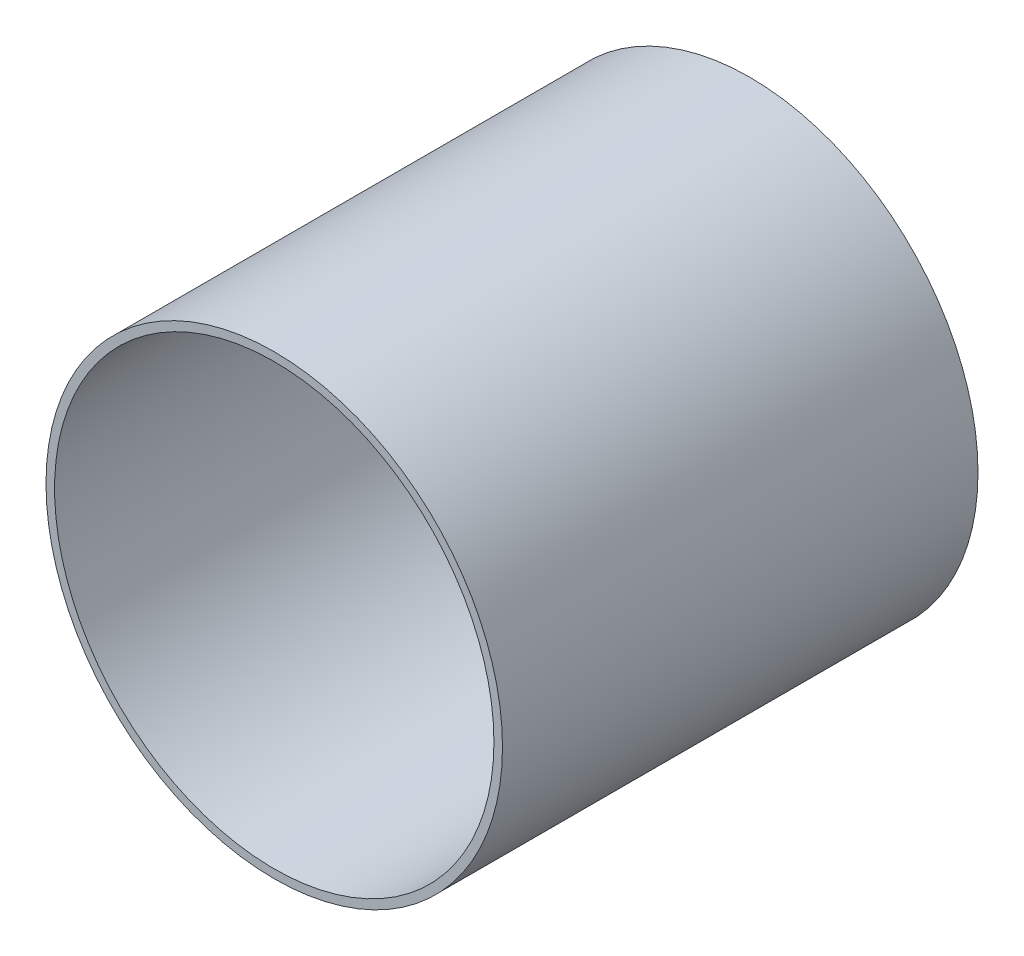
ISO-10303-21;
HEADER;
FILE_DESCRIPTION(('STEP AP214'),'2;1');
FILE_NAME('part.step','',(''),(''),'','','');
FILE_SCHEMA(('AUTOMOTIVE_DESIGN { 1 0 10303 214 1 1 1 1 }'));
ENDSEC;
DATA;
#1=APPLICATION_CONTEXT('core data for automotive mechanical design processes');
#2=APPLICATION_PROTOCOL_DEFINITION('international standard','automotive_design',2000,#1);
#3=PRODUCT_CONTEXT('',#1,'mechanical');
#4=PRODUCT('Part','Part','',(#3));
#5=PRODUCT_RELATED_PRODUCT_CATEGORY('part','',(#4));
#6=PRODUCT_DEFINITION_FORMATION('','',#4);
#7=PRODUCT_DEFINITION_CONTEXT('part definition',#1,'design');
#8=PRODUCT_DEFINITION('design','',#6,#7);
#9=PRODUCT_DEFINITION_SHAPE('','',#8);
#10=(LENGTH_UNIT() NAMED_UNIT(*) SI_UNIT(.MILLI.,.METRE.));
#11=(NAMED_UNIT(*) PLANE_ANGLE_UNIT() SI_UNIT($,.RADIAN.));
#12=(NAMED_UNIT(*) SI_UNIT($,.STERADIAN.) SOLID_ANGLE_UNIT());
#13=UNCERTAINTY_MEASURE_WITH_UNIT(LENGTH_MEASURE(1.E-05),#10,'distance_accuracy_value','');
#14=(GEOMETRIC_REPRESENTATION_CONTEXT(3) GLOBAL_UNCERTAINTY_ASSIGNED_CONTEXT((#13)) GLOBAL_UNIT_ASSIGNED_CONTEXT((#10,
#11,#12)) REPRESENTATION_CONTEXT('',''));
#15=CARTESIAN_POINT('',(0.,0.,0.));
#16=DIRECTION('',(0.,0.,1.));
#17=DIRECTION('',(1.,0.,0.));
#18=AXIS2_PLACEMENT_3D('',#15,#16,#17);
#19=CARTESIAN_POINT('',(0.,0.,25.));
#20=DIRECTION('',(0.,0.,1.));
#21=DIRECTION('',(1.,0.,0.));
#22=AXIS2_PLACEMENT_3D('',#19,#20,#21);
#23=PLANE('',#22);
#24=CARTESIAN_POINT('',(0.,0.,25.));
#25=DIRECTION('',(0.,0.,1.));
#26=DIRECTION('',(1.,0.,0.));
#27=AXIS2_PLACEMENT_3D('',#24,#25,#26);
#28=CIRCLE('',#27,12.);
#29=CARTESIAN_POINT('',(12.,0.,25.));
#30=VERTEX_POINT('',#29);
#31=EDGE_CURVE('E10',#30,#30,#28,.T.);
#32=ORIENTED_EDGE('',*,*,#31,.T.);
#33=EDGE_LOOP('',(#32));
#34=FACE_BOUND('',#33,.T.);
#35=CARTESIAN_POINT('',(0.,0.,25.));
#36=DIRECTION('',(0.,0.,1.));
#37=DIRECTION('',(1.,0.,0.));
#38=AXIS2_PLACEMENT_3D('',#35,#36,#37);
#39=CIRCLE('',#38,11.55);
#40=CARTESIAN_POINT('',(11.55,0.,25.));
#41=VERTEX_POINT('',#40);
#42=EDGE_CURVE('E42',#41,#41,#39,.T.);
#43=ORIENTED_EDGE('',*,*,#42,.F.);
#44=EDGE_LOOP('',(#43));
#45=FACE_BOUND('',#44,.T.);
#46=ADVANCED_FACE('F31',(#34,#45),#23,.T.);
#47=CARTESIAN_POINT('',(0.,0.,0.));
#48=DIRECTION('',(0.,0.,1.));
#49=DIRECTION('',(1.,0.,0.));
#50=AXIS2_PLACEMENT_3D('',#47,#48,#49);
#51=PLANE('',#50);
#52=CARTESIAN_POINT('',(0.,0.,0.));
#53=DIRECTION('',(0.,0.,1.));
#54=DIRECTION('',(1.,0.,0.));
#55=AXIS2_PLACEMENT_3D('',#52,#53,#54);
#56=CIRCLE('',#55,12.);
#57=CARTESIAN_POINT('',(12.,0.,0.));
#58=VERTEX_POINT('',#57);
#59=EDGE_CURVE('E35',#58,#58,#56,.T.);
#60=ORIENTED_EDGE('',*,*,#59,.F.);
#61=EDGE_LOOP('',(#60));
#62=FACE_BOUND('',#61,.T.);
#63=CARTESIAN_POINT('',(0.,0.,0.));
#64=DIRECTION('',(0.,0.,1.));
#65=DIRECTION('',(1.,0.,0.));
#66=AXIS2_PLACEMENT_3D('',#63,#64,#65);
#67=CIRCLE('',#66,11.55);
#68=CARTESIAN_POINT('',(11.55,0.,0.));
#69=VERTEX_POINT('',#68);
#70=EDGE_CURVE('E44',#69,#69,#67,.T.);
#71=ORIENTED_EDGE('',*,*,#70,.T.);
#72=EDGE_LOOP('',(#71));
#73=FACE_BOUND('',#72,.T.);
#74=ADVANCED_FACE('F54',(#62,#73),#51,.F.);
#75=CARTESIAN_POINT('',(0.,0.,25.));
#76=DIRECTION('',(0.,0.,-1.));
#77=DIRECTION('',(-1.,0.,0.));
#78=AXIS2_PLACEMENT_3D('',#75,#76,#77);
#79=CYLINDRICAL_SURFACE('',#78,12.);
#80=ORIENTED_EDGE('',*,*,#31,.F.);
#81=EDGE_LOOP('',(#80));
#82=FACE_BOUND('',#81,.T.);
#83=ORIENTED_EDGE('',*,*,#59,.T.);
#84=EDGE_LOOP('',(#83));
#85=FACE_BOUND('',#84,.T.);
#86=ADVANCED_FACE('F33',(#82,#85),#79,.T.);
#87=CARTESIAN_POINT('',(0.,0.,25.));
#88=DIRECTION('',(0.,0.,-1.));
#89=DIRECTION('',(-1.,0.,0.));
#90=AXIS2_PLACEMENT_3D('',#87,#88,#89);
#91=CYLINDRICAL_SURFACE('',#90,11.55);
#92=ORIENTED_EDGE('',*,*,#42,.T.);
#93=EDGE_LOOP('',(#92));
#94=FACE_BOUND('',#93,.T.);
#95=ORIENTED_EDGE('',*,*,#70,.F.);
#96=EDGE_LOOP('',(#95));
#97=FACE_BOUND('',#96,.T.);
#98=ADVANCED_FACE('F50',(#94,#97),#91,.F.);
#99=CLOSED_SHELL('',(#46,#74,#86,#98));
#100=MANIFOLD_SOLID_BREP('B2',#99);
#101=ADVANCED_BREP_SHAPE_REPRESENTATION('',(#18,#100),#14);
#102=SHAPE_DEFINITION_REPRESENTATION(#9,#101);
ENDSEC;
END-ISO-10303-21;
